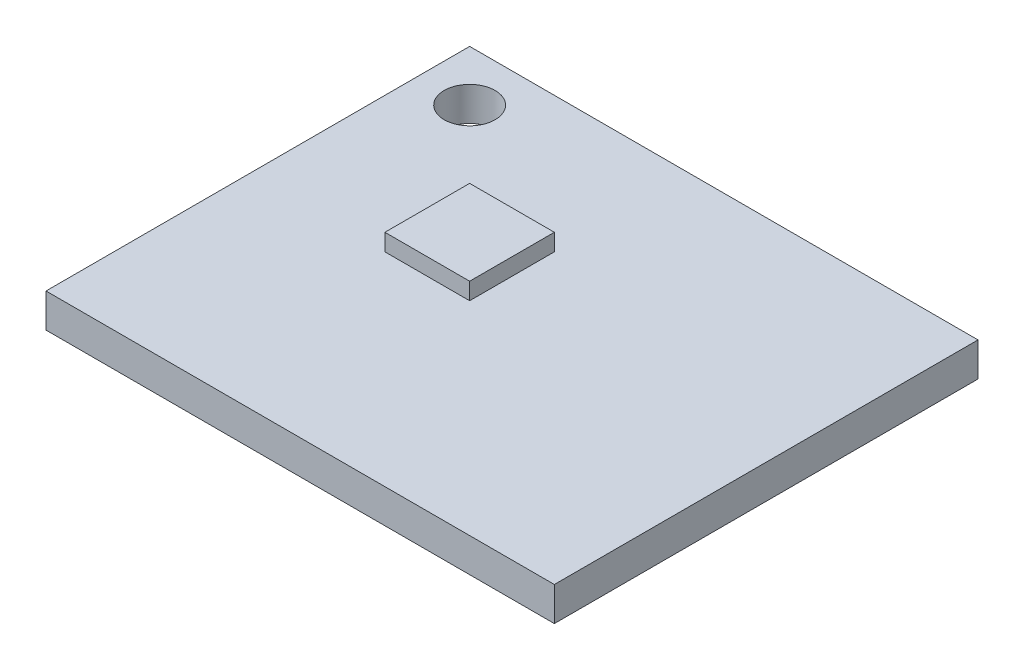
ISO-10303-21;
HEADER;
FILE_DESCRIPTION(('STEP AP214'),'2;1');
FILE_NAME('part.step','',(''),(''),'','','');
FILE_SCHEMA(('AUTOMOTIVE_DESIGN { 1 0 10303 214 1 1 1 1 }'));
ENDSEC;
DATA;
#1=APPLICATION_CONTEXT('core data for automotive mechanical design processes');
#2=APPLICATION_PROTOCOL_DEFINITION('international standard','automotive_design',2000,#1);
#3=PRODUCT_CONTEXT('',#1,'mechanical');
#4=PRODUCT('Part','Part','',(#3));
#5=PRODUCT_RELATED_PRODUCT_CATEGORY('part','',(#4));
#6=PRODUCT_DEFINITION_FORMATION('','',#4);
#7=PRODUCT_DEFINITION_CONTEXT('part definition',#1,'design');
#8=PRODUCT_DEFINITION('design','',#6,#7);
#9=PRODUCT_DEFINITION_SHAPE('','',#8);
#10=(LENGTH_UNIT() NAMED_UNIT(*) SI_UNIT(.MILLI.,.METRE.));
#11=(NAMED_UNIT(*) PLANE_ANGLE_UNIT() SI_UNIT($,.RADIAN.));
#12=(NAMED_UNIT(*) SI_UNIT($,.STERADIAN.) SOLID_ANGLE_UNIT());
#13=UNCERTAINTY_MEASURE_WITH_UNIT(LENGTH_MEASURE(1.E-05),#10,'distance_accuracy_value','');
#14=(GEOMETRIC_REPRESENTATION_CONTEXT(3) GLOBAL_UNCERTAINTY_ASSIGNED_CONTEXT((#13)) GLOBAL_UNIT_ASSIGNED_CONTEXT((#10,
#11,#12)) REPRESENTATION_CONTEXT('',''));
#15=CARTESIAN_POINT('',(0.,0.,0.));
#16=DIRECTION('',(0.,0.,1.));
#17=DIRECTION('',(1.,0.,0.));
#18=AXIS2_PLACEMENT_3D('',#15,#16,#17);
#19=CARTESIAN_POINT('',(0.,2.,0.));
#20=DIRECTION('',(0.,-1.,0.));
#21=DIRECTION('',(0.,0.,-1.));
#22=AXIS2_PLACEMENT_3D('',#19,#20,#21);
#23=PLANE('',#22);
#24=CARTESIAN_POINT('',(3.,2.,-22.));
#25=DIRECTION('',(0.,1.,0.));
#26=DIRECTION('',(0.,0.,1.));
#27=AXIS2_PLACEMENT_3D('',#24,#25,#26);
#28=CIRCLE('',#27,1.5);
#29=CARTESIAN_POINT('',(3.,2.,-20.5));
#30=VERTEX_POINT('',#29);
#31=EDGE_CURVE('E299',#30,#30,#28,.T.);
#32=ORIENTED_EDGE('',*,*,#31,.F.);
#33=EDGE_LOOP('',(#32));
#34=FACE_BOUND('',#33,.T.);
#35=DIRECTION('',(0.,0.,1.));
#36=VECTOR('',#35,1.);
#37=CARTESIAN_POINT('',(0.,2.,0.));
#38=LINE('',#37,#36);
#39=CARTESIAN_POINT('',(0.,2.,-25.));
#40=VERTEX_POINT('',#39);
#41=CARTESIAN_POINT('',(0.,2.,0.));
#42=VERTEX_POINT('',#41);
#43=EDGE_CURVE('E141',#40,#42,#38,.T.);
#44=ORIENTED_EDGE('',*,*,#43,.T.);
#45=DIRECTION('',(1.,0.,0.));
#46=VECTOR('',#45,1.);
#47=CARTESIAN_POINT('',(0.,2.,0.));
#48=LINE('',#47,#46);
#49=CARTESIAN_POINT('',(30.,2.,0.));
#50=VERTEX_POINT('',#49);
#51=EDGE_CURVE('E145',#42,#50,#48,.T.);
#52=ORIENTED_EDGE('',*,*,#51,.T.);
#53=DIRECTION('',(0.,0.,-1.));
#54=VECTOR('',#53,1.);
#55=CARTESIAN_POINT('',(30.,2.,0.));
#56=LINE('',#55,#54);
#57=CARTESIAN_POINT('',(30.,2.,-25.));
#58=VERTEX_POINT('',#57);
#59=EDGE_CURVE('E149',#50,#58,#56,.T.);
#60=ORIENTED_EDGE('',*,*,#59,.T.);
#61=DIRECTION('',(-1.,0.,0.));
#62=VECTOR('',#61,1.);
#63=CARTESIAN_POINT('',(0.,2.,-25.));
#64=LINE('',#63,#62);
#65=EDGE_CURVE('E152',#58,#40,#64,.T.);
#66=ORIENTED_EDGE('',*,*,#65,.T.);
#67=EDGE_LOOP('',(#44,#52,#60,#66));
#68=FACE_BOUND('',#67,.T.);
#69=DIRECTION('',(0.,0.,1.));
#70=VECTOR('',#69,1.);
#71=CARTESIAN_POINT('',(8.,2.,-17.));
#72=LINE('',#71,#70);
#73=CARTESIAN_POINT('',(8.,2.,-17.));
#74=VERTEX_POINT('',#73);
#75=CARTESIAN_POINT('',(8.,2.,-12.));
#76=VERTEX_POINT('',#75);
#77=EDGE_CURVE('E128',#74,#76,#72,.T.);
#78=ORIENTED_EDGE('',*,*,#77,.F.);
#79=DIRECTION('',(-1.,0.,0.));
#80=VECTOR('',#79,1.);
#81=CARTESIAN_POINT('',(8.,2.,-17.));
#82=LINE('',#81,#80);
#83=CARTESIAN_POINT('',(13.,2.,-17.));
#84=VERTEX_POINT('',#83);
#85=EDGE_CURVE('E125',#84,#74,#82,.T.);
#86=ORIENTED_EDGE('',*,*,#85,.F.);
#87=DIRECTION('',(0.,0.,-1.));
#88=VECTOR('',#87,1.);
#89=CARTESIAN_POINT('',(13.,2.,-17.));
#90=LINE('',#89,#88);
#91=CARTESIAN_POINT('',(13.,2.,-12.));
#92=VERTEX_POINT('',#91);
#93=EDGE_CURVE('E61',#92,#84,#90,.T.);
#94=ORIENTED_EDGE('',*,*,#93,.F.);
#95=DIRECTION('',(1.,0.,0.));
#96=VECTOR('',#95,1.);
#97=CARTESIAN_POINT('',(8.,2.,-12.));
#98=LINE('',#97,#96);
#99=EDGE_CURVE('E56',#76,#92,#98,.T.);
#100=ORIENTED_EDGE('',*,*,#99,.F.);
#101=EDGE_LOOP('',(#78,#86,#94,#100));
#102=FACE_BOUND('',#101,.T.);
#103=ADVANCED_FACE('F39',(#34,#68,#102),#23,.F.);
#104=CARTESIAN_POINT('',(0.,2.,0.));
#105=DIRECTION('',(1.,0.,0.));
#106=DIRECTION('',(0.,0.,-1.));
#107=AXIS2_PLACEMENT_3D('',#104,#105,#106);
#108=PLANE('',#107);
#109=DIRECTION('',(0.,0.,1.));
#110=VECTOR('',#109,1.);
#111=CARTESIAN_POINT('',(0.,0.,0.));
#112=LINE('',#111,#110);
#113=CARTESIAN_POINT('',(0.,0.,-25.));
#114=VERTEX_POINT('',#113);
#115=CARTESIAN_POINT('',(0.,0.,0.));
#116=VERTEX_POINT('',#115);
#117=EDGE_CURVE('E130',#114,#116,#112,.T.);
#118=ORIENTED_EDGE('',*,*,#117,.T.);
#119=DIRECTION('',(0.,-1.,0.));
#120=VECTOR('',#119,1.);
#121=CARTESIAN_POINT('',(0.,2.,0.));
#122=LINE('',#121,#120);
#123=EDGE_CURVE('E11',#42,#116,#122,.T.);
#124=ORIENTED_EDGE('',*,*,#123,.F.);
#125=ORIENTED_EDGE('',*,*,#43,.F.);
#126=DIRECTION('',(0.,-1.,0.));
#127=VECTOR('',#126,1.);
#128=CARTESIAN_POINT('',(0.,2.,-25.));
#129=LINE('',#128,#127);
#130=EDGE_CURVE('E154',#40,#114,#129,.T.);
#131=ORIENTED_EDGE('',*,*,#130,.T.);
#132=EDGE_LOOP('',(#118,#124,#125,#131));
#133=FACE_BOUND('',#132,.T.);
#134=ADVANCED_FACE('F41',(#133),#108,.F.);
#135=CARTESIAN_POINT('',(0.,2.,0.));
#136=DIRECTION('',(0.,0.,-1.));
#137=DIRECTION('',(-1.,0.,0.));
#138=AXIS2_PLACEMENT_3D('',#135,#136,#137);
#139=PLANE('',#138);
#140=DIRECTION('',(1.,0.,0.));
#141=VECTOR('',#140,1.);
#142=CARTESIAN_POINT('',(0.,0.,0.));
#143=LINE('',#142,#141);
#144=CARTESIAN_POINT('',(30.,0.,0.));
#145=VERTEX_POINT('',#144);
#146=EDGE_CURVE('E135',#116,#145,#143,.T.);
#147=ORIENTED_EDGE('',*,*,#146,.T.);
#148=DIRECTION('',(0.,-1.,0.));
#149=VECTOR('',#148,1.);
#150=CARTESIAN_POINT('',(30.,2.,0.));
#151=LINE('',#150,#149);
#152=EDGE_CURVE('E49',#50,#145,#151,.T.);
#153=ORIENTED_EDGE('',*,*,#152,.F.);
#154=ORIENTED_EDGE('',*,*,#51,.F.);
#155=ORIENTED_EDGE('',*,*,#123,.T.);
#156=EDGE_LOOP('',(#147,#153,#154,#155));
#157=FACE_BOUND('',#156,.T.);
#158=ADVANCED_FACE('F191',(#157),#139,.F.);
#159=CARTESIAN_POINT('',(30.,2.,0.));
#160=DIRECTION('',(-1.,0.,0.));
#161=DIRECTION('',(0.,0.,1.));
#162=AXIS2_PLACEMENT_3D('',#159,#160,#161);
#163=PLANE('',#162);
#164=DIRECTION('',(0.,0.,-1.));
#165=VECTOR('',#164,1.);
#166=CARTESIAN_POINT('',(30.,0.,0.));
#167=LINE('',#166,#165);
#168=CARTESIAN_POINT('',(30.,0.,-25.));
#169=VERTEX_POINT('',#168);
#170=EDGE_CURVE('E158',#145,#169,#167,.T.);
#171=ORIENTED_EDGE('',*,*,#170,.T.);
#172=DIRECTION('',(0.,-1.,0.));
#173=VECTOR('',#172,1.);
#174=CARTESIAN_POINT('',(30.,2.,-25.));
#175=LINE('',#174,#173);
#176=EDGE_CURVE('E166',#58,#169,#175,.T.);
#177=ORIENTED_EDGE('',*,*,#176,.F.);
#178=ORIENTED_EDGE('',*,*,#59,.F.);
#179=ORIENTED_EDGE('',*,*,#152,.T.);
#180=EDGE_LOOP('',(#171,#177,#178,#179));
#181=FACE_BOUND('',#180,.T.);
#182=ADVANCED_FACE('F176',(#181),#163,.F.);
#183=CARTESIAN_POINT('',(0.,2.,-25.));
#184=DIRECTION('',(0.,0.,1.));
#185=DIRECTION('',(1.,0.,0.));
#186=AXIS2_PLACEMENT_3D('',#183,#184,#185);
#187=PLANE('',#186);
#188=DIRECTION('',(-1.,0.,0.));
#189=VECTOR('',#188,1.);
#190=CARTESIAN_POINT('',(0.,0.,-25.));
#191=LINE('',#190,#189);
#192=EDGE_CURVE('E146',#169,#114,#191,.T.);
#193=ORIENTED_EDGE('',*,*,#192,.T.);
#194=ORIENTED_EDGE('',*,*,#130,.F.);
#195=ORIENTED_EDGE('',*,*,#65,.F.);
#196=ORIENTED_EDGE('',*,*,#176,.T.);
#197=EDGE_LOOP('',(#193,#194,#195,#196));
#198=FACE_BOUND('',#197,.T.);
#199=ADVANCED_FACE('F185',(#198),#187,.F.);
#200=CARTESIAN_POINT('',(0.,0.,0.));
#201=DIRECTION('',(0.,-1.,0.));
#202=DIRECTION('',(0.,0.,-1.));
#203=AXIS2_PLACEMENT_3D('',#200,#201,#202);
#204=PLANE('',#203);
#205=CARTESIAN_POINT('',(3.,0.,-22.));
#206=DIRECTION('',(0.,-1.,0.));
#207=DIRECTION('',(0.,0.,-1.));
#208=AXIS2_PLACEMENT_3D('',#205,#206,#207);
#209=CIRCLE('',#208,1.5);
#210=CARTESIAN_POINT('',(3.,0.,-23.5));
#211=VERTEX_POINT('',#210);
#212=EDGE_CURVE('E43',#211,#211,#209,.T.);
#213=ORIENTED_EDGE('',*,*,#212,.F.);
#214=EDGE_LOOP('',(#213));
#215=FACE_BOUND('',#214,.T.);
#216=ORIENTED_EDGE('',*,*,#117,.F.);
#217=ORIENTED_EDGE('',*,*,#192,.F.);
#218=ORIENTED_EDGE('',*,*,#170,.F.);
#219=ORIENTED_EDGE('',*,*,#146,.F.);
#220=EDGE_LOOP('',(#216,#217,#218,#219));
#221=FACE_BOUND('',#220,.T.);
#222=ADVANCED_FACE('F182',(#215,#221),#204,.T.);
#223=CARTESIAN_POINT('',(8.,3.,-17.));
#224=DIRECTION('',(1.,0.,0.));
#225=DIRECTION('',(0.,0.,-1.));
#226=AXIS2_PLACEMENT_3D('',#223,#224,#225);
#227=PLANE('',#226);
#228=ORIENTED_EDGE('',*,*,#77,.T.);
#229=DIRECTION('',(0.,-1.,0.));
#230=VECTOR('',#229,1.);
#231=CARTESIAN_POINT('',(8.,3.,-12.));
#232=LINE('',#231,#230);
#233=CARTESIAN_POINT('',(8.,3.,-12.));
#234=VERTEX_POINT('',#233);
#235=EDGE_CURVE('E107',#234,#76,#232,.T.);
#236=ORIENTED_EDGE('',*,*,#235,.F.);
#237=DIRECTION('',(0.,0.,1.));
#238=VECTOR('',#237,1.);
#239=CARTESIAN_POINT('',(8.,3.,-17.));
#240=LINE('',#239,#238);
#241=CARTESIAN_POINT('',(8.,3.,-17.));
#242=VERTEX_POINT('',#241);
#243=EDGE_CURVE('E115',#242,#234,#240,.T.);
#244=ORIENTED_EDGE('',*,*,#243,.F.);
#245=DIRECTION('',(0.,-1.,0.));
#246=VECTOR('',#245,1.);
#247=CARTESIAN_POINT('',(8.,3.,-17.));
#248=LINE('',#247,#246);
#249=EDGE_CURVE('E308',#242,#74,#248,.T.);
#250=ORIENTED_EDGE('',*,*,#249,.T.);
#251=EDGE_LOOP('',(#228,#236,#244,#250));
#252=FACE_BOUND('',#251,.T.);
#253=ADVANCED_FACE('F127',(#252),#227,.F.);
#254=CARTESIAN_POINT('',(8.,3.,-12.));
#255=DIRECTION('',(0.,0.,-1.));
#256=DIRECTION('',(-1.,0.,0.));
#257=AXIS2_PLACEMENT_3D('',#254,#255,#256);
#258=PLANE('',#257);
#259=ORIENTED_EDGE('',*,*,#99,.T.);
#260=DIRECTION('',(0.,-1.,0.));
#261=VECTOR('',#260,1.);
#262=CARTESIAN_POINT('',(13.,3.,-12.));
#263=LINE('',#262,#261);
#264=CARTESIAN_POINT('',(13.,3.,-12.));
#265=VERTEX_POINT('',#264);
#266=EDGE_CURVE('E110',#265,#92,#263,.T.);
#267=ORIENTED_EDGE('',*,*,#266,.F.);
#268=DIRECTION('',(1.,0.,0.));
#269=VECTOR('',#268,1.);
#270=CARTESIAN_POINT('',(8.,3.,-12.));
#271=LINE('',#270,#269);
#272=EDGE_CURVE('E103',#234,#265,#271,.T.);
#273=ORIENTED_EDGE('',*,*,#272,.F.);
#274=ORIENTED_EDGE('',*,*,#235,.T.);
#275=EDGE_LOOP('',(#259,#267,#273,#274));
#276=FACE_BOUND('',#275,.T.);
#277=ADVANCED_FACE('F105',(#276),#258,.F.);
#278=CARTESIAN_POINT('',(13.,3.,-17.));
#279=DIRECTION('',(-1.,0.,0.));
#280=DIRECTION('',(0.,0.,1.));
#281=AXIS2_PLACEMENT_3D('',#278,#279,#280);
#282=PLANE('',#281);
#283=ORIENTED_EDGE('',*,*,#93,.T.);
#284=DIRECTION('',(0.,-1.,0.));
#285=VECTOR('',#284,1.);
#286=CARTESIAN_POINT('',(13.,3.,-17.));
#287=LINE('',#286,#285);
#288=CARTESIAN_POINT('',(13.,3.,-17.));
#289=VERTEX_POINT('',#288);
#290=EDGE_CURVE('E137',#289,#84,#287,.T.);
#291=ORIENTED_EDGE('',*,*,#290,.F.);
#292=DIRECTION('',(0.,0.,-1.));
#293=VECTOR('',#292,1.);
#294=CARTESIAN_POINT('',(13.,3.,-17.));
#295=LINE('',#294,#293);
#296=EDGE_CURVE('E114',#265,#289,#295,.T.);
#297=ORIENTED_EDGE('',*,*,#296,.F.);
#298=ORIENTED_EDGE('',*,*,#266,.T.);
#299=EDGE_LOOP('',(#283,#291,#297,#298));
#300=FACE_BOUND('',#299,.T.);
#301=ADVANCED_FACE('F231',(#300),#282,.F.);
#302=CARTESIAN_POINT('',(8.,3.,-17.));
#303=DIRECTION('',(0.,0.,1.));
#304=DIRECTION('',(1.,0.,0.));
#305=AXIS2_PLACEMENT_3D('',#302,#303,#304);
#306=PLANE('',#305);
#307=ORIENTED_EDGE('',*,*,#85,.T.);
#308=ORIENTED_EDGE('',*,*,#249,.F.);
#309=DIRECTION('',(-1.,0.,0.));
#310=VECTOR('',#309,1.);
#311=CARTESIAN_POINT('',(8.,3.,-17.));
#312=LINE('',#311,#310);
#313=EDGE_CURVE('E120',#289,#242,#312,.T.);
#314=ORIENTED_EDGE('',*,*,#313,.F.);
#315=ORIENTED_EDGE('',*,*,#290,.T.);
#316=EDGE_LOOP('',(#307,#308,#314,#315));
#317=FACE_BOUND('',#316,.T.);
#318=ADVANCED_FACE('F237',(#317),#306,.F.);
#319=CARTESIAN_POINT('',(0.,3.,0.));
#320=DIRECTION('',(0.,1.,0.));
#321=DIRECTION('',(0.,0.,1.));
#322=AXIS2_PLACEMENT_3D('',#319,#320,#321);
#323=PLANE('',#322);
#324=ORIENTED_EDGE('',*,*,#243,.T.);
#325=ORIENTED_EDGE('',*,*,#272,.T.);
#326=ORIENTED_EDGE('',*,*,#296,.T.);
#327=ORIENTED_EDGE('',*,*,#313,.T.);
#328=EDGE_LOOP('',(#324,#325,#326,#327));
#329=FACE_BOUND('',#328,.T.);
#330=ADVANCED_FACE('F118',(#329),#323,.T.);
#331=CARTESIAN_POINT('',(3.,-2.,-22.));
#332=DIRECTION('',(0.,1.,0.));
#333=DIRECTION('',(0.,0.,1.));
#334=AXIS2_PLACEMENT_3D('',#331,#332,#333);
#335=CYLINDRICAL_SURFACE('',#334,1.5);
#336=ORIENTED_EDGE('',*,*,#212,.T.);
#337=EDGE_LOOP('',(#336));
#338=FACE_BOUND('',#337,.T.);
#339=ORIENTED_EDGE('',*,*,#31,.T.);
#340=EDGE_LOOP('',(#339));
#341=FACE_BOUND('',#340,.T.);
#342=ADVANCED_FACE('F252',(#338,#341),#335,.F.);
#343=CLOSED_SHELL('',(#103,#134,#158,#182,#199,#222,#253,#277,#301,#318,#330,#342));
#344=MANIFOLD_SOLID_BREP('B2',#343);
#345=ADVANCED_BREP_SHAPE_REPRESENTATION('',(#18,#344),#14);
#346=SHAPE_DEFINITION_REPRESENTATION(#9,#345);
ENDSEC;
END-ISO-10303-21;
